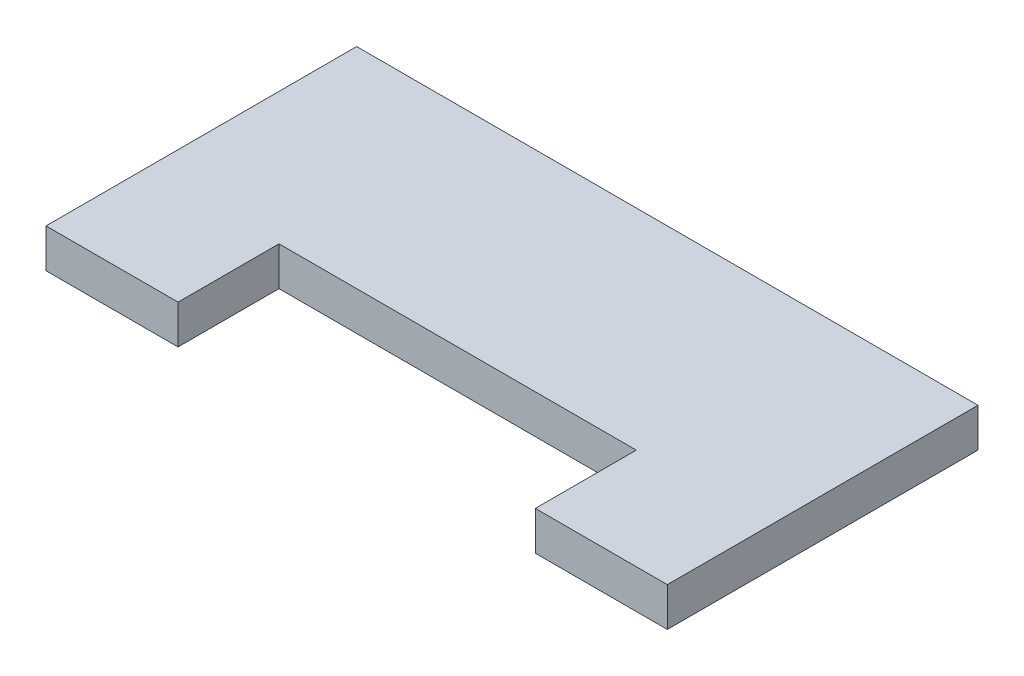
ISO-10303-21;
HEADER;
FILE_DESCRIPTION(('STEP AP214'),'2;1');
FILE_NAME('part.step','',(''),(''),'','','');
FILE_SCHEMA(('AUTOMOTIVE_DESIGN { 1 0 10303 214 1 1 1 1 }'));
ENDSEC;
DATA;
#1=APPLICATION_CONTEXT('core data for automotive mechanical design processes');
#2=APPLICATION_PROTOCOL_DEFINITION('international standard','automotive_design',2000,#1);
#3=PRODUCT_CONTEXT('',#1,'mechanical');
#4=PRODUCT('Part','Part','',(#3));
#5=PRODUCT_RELATED_PRODUCT_CATEGORY('part','',(#4));
#6=PRODUCT_DEFINITION_FORMATION('','',#4);
#7=PRODUCT_DEFINITION_CONTEXT('part definition',#1,'design');
#8=PRODUCT_DEFINITION('design','',#6,#7);
#9=PRODUCT_DEFINITION_SHAPE('','',#8);
#10=(LENGTH_UNIT() NAMED_UNIT(*) SI_UNIT(.MILLI.,.METRE.));
#11=(NAMED_UNIT(*) PLANE_ANGLE_UNIT() SI_UNIT($,.RADIAN.));
#12=(NAMED_UNIT(*) SI_UNIT($,.STERADIAN.) SOLID_ANGLE_UNIT());
#13=UNCERTAINTY_MEASURE_WITH_UNIT(LENGTH_MEASURE(1.E-05),#10,'distance_accuracy_value','');
#14=(GEOMETRIC_REPRESENTATION_CONTEXT(3) GLOBAL_UNCERTAINTY_ASSIGNED_CONTEXT((#13)) GLOBAL_UNIT_ASSIGNED_CONTEXT((#10,
#11,#12)) REPRESENTATION_CONTEXT('',''));
#15=CARTESIAN_POINT('',(0.,0.,0.));
#16=DIRECTION('',(0.,0.,1.));
#17=DIRECTION('',(1.,0.,0.));
#18=AXIS2_PLACEMENT_3D('',#15,#16,#17);
#19=CARTESIAN_POINT('',(-17.,5.,0.));
#20=DIRECTION('',(-1.,0.,0.));
#21=DIRECTION('',(0.,0.,1.));
#22=AXIS2_PLACEMENT_3D('',#19,#20,#21);
#23=PLANE('',#22);
#24=DIRECTION('',(0.,0.,-1.));
#25=VECTOR('',#24,1.);
#26=CARTESIAN_POINT('',(-17.,0.,0.));
#27=LINE('',#26,#25);
#28=CARTESIAN_POINT('',(-17.,0.,0.));
#29=VERTEX_POINT('',#28);
#30=CARTESIAN_POINT('',(-17.,0.,-13.));
#31=VERTEX_POINT('',#30);
#32=EDGE_CURVE('E165',#29,#31,#27,.T.);
#33=ORIENTED_EDGE('',*,*,#32,.F.);
#34=DIRECTION('',(0.,-1.,0.));
#35=VECTOR('',#34,1.);
#36=CARTESIAN_POINT('',(-17.,5.,0.));
#37=LINE('',#36,#35);
#38=CARTESIAN_POINT('',(-17.,5.,0.));
#39=VERTEX_POINT('',#38);
#40=EDGE_CURVE('E11',#39,#29,#37,.T.);
#41=ORIENTED_EDGE('',*,*,#40,.F.);
#42=DIRECTION('',(0.,0.,-1.));
#43=VECTOR('',#42,1.);
#44=CARTESIAN_POINT('',(-17.,5.,0.));
#45=LINE('',#44,#43);
#46=CARTESIAN_POINT('',(-17.,5.,-13.));
#47=VERTEX_POINT('',#46);
#48=EDGE_CURVE('E130',#39,#47,#45,.T.);
#49=ORIENTED_EDGE('',*,*,#48,.T.);
#50=DIRECTION('',(0.,-1.,0.));
#51=VECTOR('',#50,1.);
#52=CARTESIAN_POINT('',(-17.,5.,-13.));
#53=LINE('',#52,#51);
#54=EDGE_CURVE('E85',#47,#31,#53,.T.);
#55=ORIENTED_EDGE('',*,*,#54,.T.);
#56=EDGE_LOOP('',(#33,#41,#49,#55));
#57=FACE_BOUND('',#56,.T.);
#58=ADVANCED_FACE('F35',(#57),#23,.T.);
#59=CARTESIAN_POINT('',(0.,5.,0.));
#60=DIRECTION('',(0.,0.,1.));
#61=DIRECTION('',(1.,0.,0.));
#62=AXIS2_PLACEMENT_3D('',#59,#60,#61);
#63=PLANE('',#62);
#64=DIRECTION('',(-1.,0.,0.));
#65=VECTOR('',#64,1.);
#66=CARTESIAN_POINT('',(0.,0.,0.));
#67=LINE('',#66,#65);
#68=CARTESIAN_POINT('',(0.,0.,0.));
#69=VERTEX_POINT('',#68);
#70=EDGE_CURVE('E159',#69,#29,#67,.T.);
#71=ORIENTED_EDGE('',*,*,#70,.F.);
#72=DIRECTION('',(0.,-1.,0.));
#73=VECTOR('',#72,1.);
#74=CARTESIAN_POINT('',(0.,5.,0.));
#75=LINE('',#74,#73);
#76=CARTESIAN_POINT('',(0.,5.,0.));
#77=VERTEX_POINT('',#76);
#78=EDGE_CURVE('E43',#77,#69,#75,.T.);
#79=ORIENTED_EDGE('',*,*,#78,.F.);
#80=DIRECTION('',(-1.,0.,0.));
#81=VECTOR('',#80,1.);
#82=CARTESIAN_POINT('',(0.,5.,0.));
#83=LINE('',#82,#81);
#84=EDGE_CURVE('E123',#77,#39,#83,.T.);
#85=ORIENTED_EDGE('',*,*,#84,.T.);
#86=ORIENTED_EDGE('',*,*,#40,.T.);
#87=EDGE_LOOP('',(#71,#79,#85,#86));
#88=FACE_BOUND('',#87,.T.);
#89=ADVANCED_FACE('F164',(#88),#63,.T.);
#90=CARTESIAN_POINT('',(0.,5.,0.));
#91=DIRECTION('',(-1.,0.,0.));
#92=DIRECTION('',(0.,0.,1.));
#93=AXIS2_PLACEMENT_3D('',#90,#91,#92);
#94=PLANE('',#93);
#95=DIRECTION('',(0.,0.,-1.));
#96=VECTOR('',#95,1.);
#97=CARTESIAN_POINT('',(0.,0.,0.));
#98=LINE('',#97,#96);
#99=CARTESIAN_POINT('',(0.,0.,-40.));
#100=VERTEX_POINT('',#99);
#101=EDGE_CURVE('E153',#69,#100,#98,.T.);
#102=ORIENTED_EDGE('',*,*,#101,.T.);
#103=DIRECTION('',(0.,-1.,0.));
#104=VECTOR('',#103,1.);
#105=CARTESIAN_POINT('',(0.,5.,-40.));
#106=LINE('',#105,#104);
#107=CARTESIAN_POINT('',(0.,5.,-40.));
#108=VERTEX_POINT('',#107);
#109=EDGE_CURVE('E146',#108,#100,#106,.T.);
#110=ORIENTED_EDGE('',*,*,#109,.F.);
#111=DIRECTION('',(0.,0.,-1.));
#112=VECTOR('',#111,1.);
#113=CARTESIAN_POINT('',(0.,5.,0.));
#114=LINE('',#113,#112);
#115=EDGE_CURVE('E129',#77,#108,#114,.T.);
#116=ORIENTED_EDGE('',*,*,#115,.F.);
#117=ORIENTED_EDGE('',*,*,#78,.T.);
#118=EDGE_LOOP('',(#102,#110,#116,#117));
#119=FACE_BOUND('',#118,.T.);
#120=ADVANCED_FACE('F151',(#119),#94,.F.);
#121=CARTESIAN_POINT('',(0.,5.,-40.));
#122=DIRECTION('',(0.,0.,1.));
#123=DIRECTION('',(1.,0.,0.));
#124=AXIS2_PLACEMENT_3D('',#121,#122,#123);
#125=PLANE('',#124);
#126=DIRECTION('',(-1.,0.,0.));
#127=VECTOR('',#126,1.);
#128=CARTESIAN_POINT('',(0.,0.,-40.));
#129=LINE('',#128,#127);
#130=CARTESIAN_POINT('',(-80.,0.,-40.));
#131=VERTEX_POINT('',#130);
#132=EDGE_CURVE('E162',#100,#131,#129,.T.);
#133=ORIENTED_EDGE('',*,*,#132,.T.);
#134=DIRECTION('',(0.,-1.,0.));
#135=VECTOR('',#134,1.);
#136=CARTESIAN_POINT('',(-80.,5.,-40.));
#137=LINE('',#136,#135);
#138=CARTESIAN_POINT('',(-80.,5.,-40.));
#139=VERTEX_POINT('',#138);
#140=EDGE_CURVE('E144',#139,#131,#137,.T.);
#141=ORIENTED_EDGE('',*,*,#140,.F.);
#142=DIRECTION('',(-1.,0.,0.));
#143=VECTOR('',#142,1.);
#144=CARTESIAN_POINT('',(0.,5.,-40.));
#145=LINE('',#144,#143);
#146=EDGE_CURVE('E124',#108,#139,#145,.T.);
#147=ORIENTED_EDGE('',*,*,#146,.F.);
#148=ORIENTED_EDGE('',*,*,#109,.T.);
#149=EDGE_LOOP('',(#133,#141,#147,#148));
#150=FACE_BOUND('',#149,.T.);
#151=ADVANCED_FACE('F173',(#150),#125,.F.);
#152=CARTESIAN_POINT('',(-80.,5.,0.));
#153=DIRECTION('',(-1.,0.,0.));
#154=DIRECTION('',(0.,0.,1.));
#155=AXIS2_PLACEMENT_3D('',#152,#153,#154);
#156=PLANE('',#155);
#157=DIRECTION('',(0.,0.,-1.));
#158=VECTOR('',#157,1.);
#159=CARTESIAN_POINT('',(-80.,0.,0.));
#160=LINE('',#159,#158);
#161=CARTESIAN_POINT('',(-80.,0.,0.));
#162=VERTEX_POINT('',#161);
#163=EDGE_CURVE('E168',#162,#131,#160,.T.);
#164=ORIENTED_EDGE('',*,*,#163,.F.);
#165=DIRECTION('',(0.,-1.,0.));
#166=VECTOR('',#165,1.);
#167=CARTESIAN_POINT('',(-80.,5.,0.));
#168=LINE('',#167,#166);
#169=CARTESIAN_POINT('',(-80.,5.,0.));
#170=VERTEX_POINT('',#169);
#171=EDGE_CURVE('E112',#170,#162,#168,.T.);
#172=ORIENTED_EDGE('',*,*,#171,.F.);
#173=DIRECTION('',(0.,0.,-1.));
#174=VECTOR('',#173,1.);
#175=CARTESIAN_POINT('',(-80.,5.,0.));
#176=LINE('',#175,#174);
#177=EDGE_CURVE('E121',#170,#139,#176,.T.);
#178=ORIENTED_EDGE('',*,*,#177,.T.);
#179=ORIENTED_EDGE('',*,*,#140,.T.);
#180=EDGE_LOOP('',(#164,#172,#178,#179));
#181=FACE_BOUND('',#180,.T.);
#182=ADVANCED_FACE('F178',(#181),#156,.T.);
#183=CARTESIAN_POINT('',(-63.,0.,0.));
#184=VERTEX_POINT('',#183);
#185=EDGE_CURVE('E111',#184,#162,#67,.T.);
#186=ORIENTED_EDGE('',*,*,#185,.F.);
#187=DIRECTION('',(0.,-1.,0.));
#188=VECTOR('',#187,1.);
#189=CARTESIAN_POINT('',(-63.,5.,0.));
#190=LINE('',#189,#188);
#191=CARTESIAN_POINT('',(-63.,5.,0.));
#192=VERTEX_POINT('',#191);
#193=EDGE_CURVE('E105',#192,#184,#190,.T.);
#194=ORIENTED_EDGE('',*,*,#193,.F.);
#195=EDGE_CURVE('E109',#192,#170,#83,.T.);
#196=ORIENTED_EDGE('',*,*,#195,.T.);
#197=ORIENTED_EDGE('',*,*,#171,.T.);
#198=EDGE_LOOP('',(#186,#194,#196,#197));
#199=FACE_BOUND('',#198,.T.);
#200=ADVANCED_FACE('F107',(#199),#63,.T.);
#201=CARTESIAN_POINT('',(-63.,5.,0.));
#202=DIRECTION('',(-1.,0.,0.));
#203=DIRECTION('',(0.,0.,1.));
#204=AXIS2_PLACEMENT_3D('',#201,#202,#203);
#205=PLANE('',#204);
#206=DIRECTION('',(0.,0.,-1.));
#207=VECTOR('',#206,1.);
#208=CARTESIAN_POINT('',(-63.,0.,0.));
#209=LINE('',#208,#207);
#210=CARTESIAN_POINT('',(-63.,0.,-13.));
#211=VERTEX_POINT('',#210);
#212=EDGE_CURVE('E78',#184,#211,#209,.T.);
#213=ORIENTED_EDGE('',*,*,#212,.T.);
#214=DIRECTION('',(0.,-1.,0.));
#215=VECTOR('',#214,1.);
#216=CARTESIAN_POINT('',(-63.,5.,-13.));
#217=LINE('',#216,#215);
#218=CARTESIAN_POINT('',(-63.,5.,-13.));
#219=VERTEX_POINT('',#218);
#220=EDGE_CURVE('E113',#219,#211,#217,.T.);
#221=ORIENTED_EDGE('',*,*,#220,.F.);
#222=DIRECTION('',(0.,0.,-1.));
#223=VECTOR('',#222,1.);
#224=CARTESIAN_POINT('',(-63.,5.,0.));
#225=LINE('',#224,#223);
#226=EDGE_CURVE('E115',#192,#219,#225,.T.);
#227=ORIENTED_EDGE('',*,*,#226,.F.);
#228=ORIENTED_EDGE('',*,*,#193,.T.);
#229=EDGE_LOOP('',(#213,#221,#227,#228));
#230=FACE_BOUND('',#229,.T.);
#231=ADVANCED_FACE('F116',(#230),#205,.F.);
#232=CARTESIAN_POINT('',(0.,5.,-13.));
#233=DIRECTION('',(0.,0.,-1.));
#234=DIRECTION('',(-1.,0.,0.));
#235=AXIS2_PLACEMENT_3D('',#232,#233,#234);
#236=PLANE('',#235);
#237=DIRECTION('',(1.,0.,0.));
#238=VECTOR('',#237,1.);
#239=CARTESIAN_POINT('',(0.,0.,-13.));
#240=LINE('',#239,#238);
#241=EDGE_CURVE('E133',#211,#31,#240,.T.);
#242=ORIENTED_EDGE('',*,*,#241,.T.);
#243=ORIENTED_EDGE('',*,*,#54,.F.);
#244=DIRECTION('',(1.,0.,0.));
#245=VECTOR('',#244,1.);
#246=CARTESIAN_POINT('',(0.,5.,-13.));
#247=LINE('',#246,#245);
#248=EDGE_CURVE('E51',#219,#47,#247,.T.);
#249=ORIENTED_EDGE('',*,*,#248,.F.);
#250=ORIENTED_EDGE('',*,*,#220,.T.);
#251=EDGE_LOOP('',(#242,#243,#249,#250));
#252=FACE_BOUND('',#251,.T.);
#253=ADVANCED_FACE('F197',(#252),#236,.F.);
#254=CARTESIAN_POINT('',(0.,5.,0.));
#255=DIRECTION('',(0.,1.,0.));
#256=DIRECTION('',(0.,0.,1.));
#257=AXIS2_PLACEMENT_3D('',#254,#255,#256);
#258=PLANE('',#257);
#259=ORIENTED_EDGE('',*,*,#48,.F.);
#260=ORIENTED_EDGE('',*,*,#84,.F.);
#261=ORIENTED_EDGE('',*,*,#115,.T.);
#262=ORIENTED_EDGE('',*,*,#146,.T.);
#263=ORIENTED_EDGE('',*,*,#177,.F.);
#264=ORIENTED_EDGE('',*,*,#195,.F.);
#265=ORIENTED_EDGE('',*,*,#226,.T.);
#266=ORIENTED_EDGE('',*,*,#248,.T.);
#267=EDGE_LOOP('',(#259,#260,#261,#262,#263,#264,#265,#266));
#268=FACE_BOUND('',#267,.T.);
#269=ADVANCED_FACE('F119',(#268),#258,.T.);
#270=CARTESIAN_POINT('',(0.,0.,0.));
#271=DIRECTION('',(0.,1.,0.));
#272=DIRECTION('',(0.,0.,1.));
#273=AXIS2_PLACEMENT_3D('',#270,#271,#272);
#274=PLANE('',#273);
#275=ORIENTED_EDGE('',*,*,#32,.T.);
#276=ORIENTED_EDGE('',*,*,#241,.F.);
#277=ORIENTED_EDGE('',*,*,#212,.F.);
#278=ORIENTED_EDGE('',*,*,#185,.T.);
#279=ORIENTED_EDGE('',*,*,#163,.T.);
#280=ORIENTED_EDGE('',*,*,#132,.F.);
#281=ORIENTED_EDGE('',*,*,#101,.F.);
#282=ORIENTED_EDGE('',*,*,#70,.T.);
#283=EDGE_LOOP('',(#275,#276,#277,#278,#279,#280,#281,#282));
#284=FACE_BOUND('',#283,.T.);
#285=ADVANCED_FACE('F158',(#284),#274,.F.);
#286=CLOSED_SHELL('',(#58,#89,#120,#151,#182,#200,#231,#253,#269,#285));
#287=MANIFOLD_SOLID_BREP('B2',#286);
#288=ADVANCED_BREP_SHAPE_REPRESENTATION('',(#18,#287),#14);
#289=SHAPE_DEFINITION_REPRESENTATION(#9,#288);
ENDSEC;
END-ISO-10303-21;
